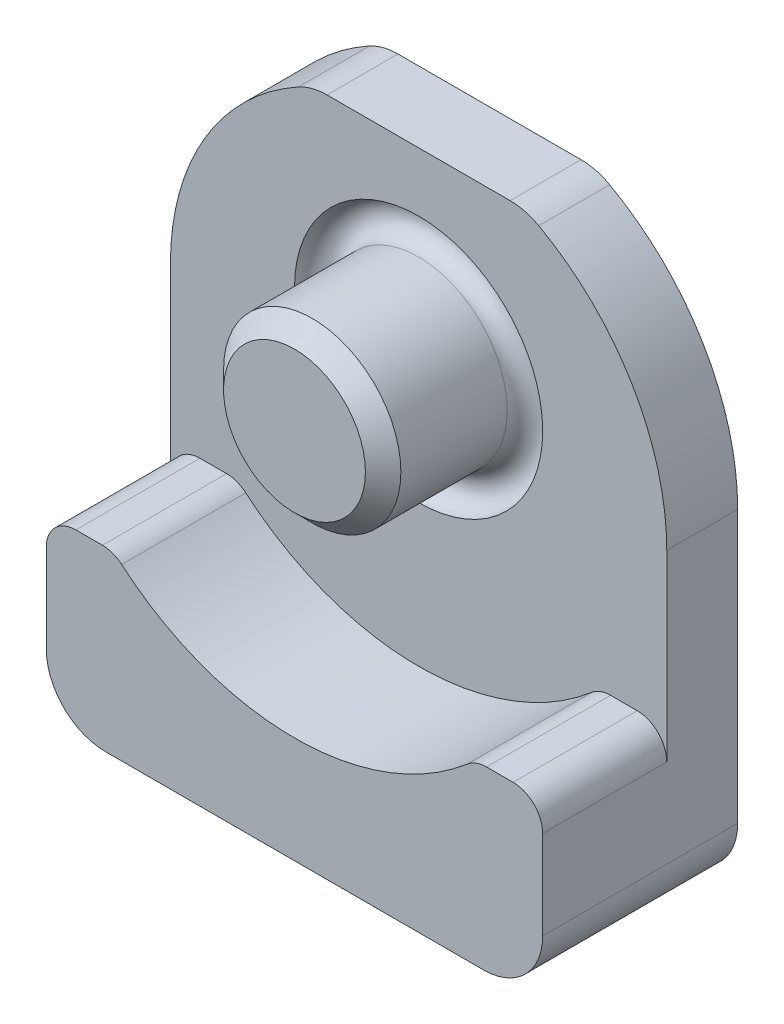
ISO-10303-21;
HEADER;
FILE_DESCRIPTION(('STEP AP214'),'2;1');
FILE_NAME('part.step','',(''),(''),'','','');
FILE_SCHEMA(('AUTOMOTIVE_DESIGN { 1 0 10303 214 1 1 1 1 }'));
ENDSEC;
DATA;
#1=APPLICATION_CONTEXT('core data for automotive mechanical design processes');
#2=APPLICATION_PROTOCOL_DEFINITION('international standard','automotive_design',2000,#1);
#3=PRODUCT_CONTEXT('',#1,'mechanical');
#4=PRODUCT('Part','Part','',(#3));
#5=PRODUCT_RELATED_PRODUCT_CATEGORY('part','',(#4));
#6=PRODUCT_DEFINITION_FORMATION('','',#4);
#7=PRODUCT_DEFINITION_CONTEXT('part definition',#1,'design');
#8=PRODUCT_DEFINITION('design','',#6,#7);
#9=PRODUCT_DEFINITION_SHAPE('','',#8);
#10=(LENGTH_UNIT() NAMED_UNIT(*) SI_UNIT(.MILLI.,.METRE.));
#11=(NAMED_UNIT(*) PLANE_ANGLE_UNIT() SI_UNIT($,.RADIAN.));
#12=(NAMED_UNIT(*) SI_UNIT($,.STERADIAN.) SOLID_ANGLE_UNIT());
#13=UNCERTAINTY_MEASURE_WITH_UNIT(LENGTH_MEASURE(1.E-05),#10,'distance_accuracy_value','');
#14=(GEOMETRIC_REPRESENTATION_CONTEXT(3) GLOBAL_UNCERTAINTY_ASSIGNED_CONTEXT((#13)) GLOBAL_UNIT_ASSIGNED_CONTEXT((#10,
#11,#12)) REPRESENTATION_CONTEXT('',''));
#15=CARTESIAN_POINT('',(0.,0.,0.));
#16=DIRECTION('',(0.,0.,1.));
#17=DIRECTION('',(1.,0.,0.));
#18=AXIS2_PLACEMENT_3D('',#15,#16,#17);
#19=CARTESIAN_POINT('',(0.,-0.399999999999999,1.2));
#20=DIRECTION('',(0.,0.,1.));
#21=DIRECTION('',(1.,0.,0.));
#22=AXIS2_PLACEMENT_3D('',#19,#20,#21);
#23=PLANE('',#22);
#24=DIRECTION('',(1.,0.,0.));
#25=VECTOR('',#24,1.);
#26=CARTESIAN_POINT('',(-1.78885438199984,3.4,1.2));
#27=LINE('',#26,#25);
#28=CARTESIAN_POINT('',(-1.54919333848297,3.4,1.2));
#29=VERTEX_POINT('',#28);
#30=CARTESIAN_POINT('',(1.54919333848297,3.4,1.2));
#31=VERTEX_POINT('',#30);
#32=EDGE_CURVE('E373',#29,#31,#27,.T.);
#33=ORIENTED_EDGE('',*,*,#32,.F.);
#34=CARTESIAN_POINT('',(-1.54919333848297,2.4,1.2));
#35=DIRECTION('',(0.,0.,1.));
#36=DIRECTION('',(1.,0.,0.));
#37=AXIS2_PLACEMENT_3D('',#34,#35,#36);
#38=CIRCLE('',#37,1.);
#39=CARTESIAN_POINT('',(-2.0333162567589,3.275,1.2));
#40=VERTEX_POINT('',#39);
#41=EDGE_CURVE('E168',#29,#40,#38,.T.);
#42=ORIENTED_EDGE('',*,*,#41,.T.);
#43=CARTESIAN_POINT('',(0.,-0.399999999999999,1.2));
#44=DIRECTION('',(0.,0.,1.));
#45=DIRECTION('',(1.,0.,0.));
#46=AXIS2_PLACEMENT_3D('',#43,#44,#45);
#47=CIRCLE('',#46,4.2);
#48=CARTESIAN_POINT('',(-4.2,-0.399999999999999,1.2));
#49=VERTEX_POINT('',#48);
#50=EDGE_CURVE('E165',#49,#40,#47,.F.);
#51=ORIENTED_EDGE('',*,*,#50,.F.);
#52=DIRECTION('',(0.,1.,0.));
#53=VECTOR('',#52,1.);
#54=CARTESIAN_POINT('',(-4.2,-0.399999999999999,1.2));
#55=LINE('',#54,#53);
#56=CARTESIAN_POINT('',(-4.2,-3.5,1.2));
#57=VERTEX_POINT('',#56);
#58=EDGE_CURVE('E57',#57,#49,#55,.T.);
#59=ORIENTED_EDGE('',*,*,#58,.F.);
#60=CARTESIAN_POINT('',(-3.7,-3.5,1.2));
#61=DIRECTION('',(0.,0.,1.));
#62=DIRECTION('',(1.,0.,0.));
#63=AXIS2_PLACEMENT_3D('',#60,#61,#62);
#64=CIRCLE('',#63,0.5);
#65=CARTESIAN_POINT('',(-3.7,-3.,1.2));
#66=VERTEX_POINT('',#65);
#67=EDGE_CURVE('E62',#57,#66,#64,.F.);
#68=ORIENTED_EDGE('',*,*,#67,.T.);
#69=DIRECTION('',(-1.,0.,0.));
#70=VECTOR('',#69,1.);
#71=CARTESIAN_POINT('',(-4.2,-3.,1.2));
#72=LINE('',#71,#70);
#73=CARTESIAN_POINT('',(-3.24961536185438,-3.,1.2));
#74=VERTEX_POINT('',#73);
#75=EDGE_CURVE('E184',#74,#66,#72,.T.);
#76=ORIENTED_EDGE('',*,*,#75,.F.);
#77=CARTESIAN_POINT('',(-3.24961536185438,-3.5,1.2));
#78=DIRECTION('',(0.,0.,1.));
#79=DIRECTION('',(1.,0.,0.));
#80=AXIS2_PLACEMENT_3D('',#77,#78,#79);
#81=CIRCLE('',#80,0.5);
#82=CARTESIAN_POINT('',(-2.92465382566894,-3.12,1.2));
#83=VERTEX_POINT('',#82);
#84=EDGE_CURVE('E270',#74,#83,#81,.F.);
#85=ORIENTED_EDGE('',*,*,#84,.T.);
#86=CARTESIAN_POINT('',(0.,0.3,1.2));
#87=DIRECTION('',(0.,0.,1.));
#88=DIRECTION('',(1.,0.,0.));
#89=AXIS2_PLACEMENT_3D('',#86,#87,#88);
#90=CIRCLE('',#89,4.5);
#91=CARTESIAN_POINT('',(2.92465382566895,-3.12,1.2));
#92=VERTEX_POINT('',#91);
#93=EDGE_CURVE('E417',#92,#83,#90,.F.);
#94=ORIENTED_EDGE('',*,*,#93,.F.);
#95=CARTESIAN_POINT('',(3.24961536185438,-3.5,1.2));
#96=DIRECTION('',(0.,0.,1.));
#97=DIRECTION('',(1.,0.,0.));
#98=AXIS2_PLACEMENT_3D('',#95,#96,#97);
#99=CIRCLE('',#98,0.5);
#100=CARTESIAN_POINT('',(3.24961536185438,-3.,1.2));
#101=VERTEX_POINT('',#100);
#102=EDGE_CURVE('E267',#92,#101,#99,.F.);
#103=ORIENTED_EDGE('',*,*,#102,.T.);
#104=DIRECTION('',(-1.,0.,0.));
#105=VECTOR('',#104,1.);
#106=CARTESIAN_POINT('',(3.05941170815567,-3.,1.2));
#107=LINE('',#106,#105);
#108=CARTESIAN_POINT('',(3.7,-3.,1.2));
#109=VERTEX_POINT('',#108);
#110=EDGE_CURVE('E411',#109,#101,#107,.T.);
#111=ORIENTED_EDGE('',*,*,#110,.F.);
#112=CARTESIAN_POINT('',(3.7,-3.5,1.2));
#113=DIRECTION('',(0.,0.,1.));
#114=DIRECTION('',(1.,0.,0.));
#115=AXIS2_PLACEMENT_3D('',#112,#113,#114);
#116=CIRCLE('',#115,0.5);
#117=CARTESIAN_POINT('',(4.2,-3.5,1.2));
#118=VERTEX_POINT('',#117);
#119=EDGE_CURVE('E264',#109,#118,#116,.F.);
#120=ORIENTED_EDGE('',*,*,#119,.T.);
#121=DIRECTION('',(0.,-1.,0.));
#122=VECTOR('',#121,1.);
#123=CARTESIAN_POINT('',(4.2,-3.,1.2));
#124=LINE('',#123,#122);
#125=CARTESIAN_POINT('',(4.2,-0.399999999999999,1.2));
#126=VERTEX_POINT('',#125);
#127=EDGE_CURVE('E376',#126,#118,#124,.T.);
#128=ORIENTED_EDGE('',*,*,#127,.F.);
#129=CARTESIAN_POINT('',(2.0333162567589,3.275,1.2));
#130=VERTEX_POINT('',#129);
#131=EDGE_CURVE('E173',#130,#126,#47,.F.);
#132=ORIENTED_EDGE('',*,*,#131,.F.);
#133=CARTESIAN_POINT('',(1.54919333848297,2.4,1.2));
#134=DIRECTION('',(0.,0.,1.));
#135=DIRECTION('',(1.,0.,0.));
#136=AXIS2_PLACEMENT_3D('',#133,#134,#135);
#137=CIRCLE('',#136,1.);
#138=EDGE_CURVE('E229',#130,#31,#137,.T.);
#139=ORIENTED_EDGE('',*,*,#138,.T.);
#140=EDGE_LOOP('',(#33,#42,#51,#59,#68,#76,#85,#94,#103,#111,#120,#128,#132,#139));
#141=FACE_BOUND('',#140,.T.);
#142=CARTESIAN_POINT('',(0.,0.3,1.2));
#143=DIRECTION('',(0.,0.,1.));
#144=DIRECTION('',(0.,-1.,0.));
#145=AXIS2_PLACEMENT_3D('',#142,#143,#144);
#146=CIRCLE('',#145,2.1);
#147=CARTESIAN_POINT('',(0.,-1.8,1.2));
#148=VERTEX_POINT('',#147);
#149=EDGE_CURVE('E424',#148,#148,#146,.T.);
#150=ORIENTED_EDGE('',*,*,#149,.F.);
#151=EDGE_LOOP('',(#150));
#152=FACE_BOUND('',#151,.T.);
#153=ADVANCED_FACE('F41',(#141,#152),#23,.T.);
#154=CARTESIAN_POINT('',(0.,-0.399999999999999,3.3));
#155=DIRECTION('',(0.,0.,-1.));
#156=DIRECTION('',(-1.,0.,0.));
#157=AXIS2_PLACEMENT_3D('',#154,#155,#156);
#158=CYLINDRICAL_SURFACE('',#157,4.2);
#159=ORIENTED_EDGE('',*,*,#50,.T.);
#160=DIRECTION('',(0.,0.,-1.));
#161=VECTOR('',#160,1.);
#162=CARTESIAN_POINT('',(-2.0333162567589,3.275,3.3));
#163=LINE('',#162,#161);
#164=CARTESIAN_POINT('',(-2.0333162567589,3.275,0.));
#165=VERTEX_POINT('',#164);
#166=EDGE_CURVE('E232',#40,#165,#163,.T.);
#167=ORIENTED_EDGE('',*,*,#166,.T.);
#168=CARTESIAN_POINT('',(0.,-0.399999999999999,0.));
#169=DIRECTION('',(0.,0.,1.));
#170=DIRECTION('',(1.,0.,0.));
#171=AXIS2_PLACEMENT_3D('',#168,#169,#170);
#172=CIRCLE('',#171,4.2);
#173=CARTESIAN_POINT('',(-4.2,-0.399999999999999,0.));
#174=VERTEX_POINT('',#173);
#175=EDGE_CURVE('E189',#165,#174,#172,.T.);
#176=ORIENTED_EDGE('',*,*,#175,.T.);
#177=DIRECTION('',(0.,0.,-1.));
#178=VECTOR('',#177,1.);
#179=CARTESIAN_POINT('',(-4.2,-0.399999999999999,3.3));
#180=LINE('',#179,#178);
#181=EDGE_CURVE('E180',#49,#174,#180,.T.);
#182=ORIENTED_EDGE('',*,*,#181,.F.);
#183=EDGE_LOOP('',(#159,#167,#176,#182));
#184=FACE_BOUND('',#183,.T.);
#185=ADVANCED_FACE('F187',(#184),#158,.T.);
#186=CARTESIAN_POINT('',(4.2,-0.399999999999998,0.));
#187=VERTEX_POINT('',#186);
#188=CARTESIAN_POINT('',(2.0333162567589,3.275,0.));
#189=VERTEX_POINT('',#188);
#190=EDGE_CURVE('E388',#187,#189,#172,.T.);
#191=ORIENTED_EDGE('',*,*,#190,.T.);
#192=DIRECTION('',(0.,0.,-1.));
#193=VECTOR('',#192,1.);
#194=CARTESIAN_POINT('',(2.0333162567589,3.275,3.3));
#195=LINE('',#194,#193);
#196=EDGE_CURVE('E234',#189,#130,#195,.F.);
#197=ORIENTED_EDGE('',*,*,#196,.T.);
#198=ORIENTED_EDGE('',*,*,#131,.T.);
#199=DIRECTION('',(0.,0.,-1.));
#200=VECTOR('',#199,1.);
#201=CARTESIAN_POINT('',(4.2,-0.399999999999998,3.3));
#202=LINE('',#201,#200);
#203=EDGE_CURVE('E190',#126,#187,#202,.T.);
#204=ORIENTED_EDGE('',*,*,#203,.T.);
#205=EDGE_LOOP('',(#191,#197,#198,#204));
#206=FACE_BOUND('',#205,.T.);
#207=ADVANCED_FACE('F290',(#206),#158,.T.);
#208=CARTESIAN_POINT('',(4.2,-6.,3.3));
#209=DIRECTION('',(0.,1.,0.));
#210=DIRECTION('',(-1.,0.,0.));
#211=AXIS2_PLACEMENT_3D('',#208,#209,#210);
#212=PLANE('',#211);
#213=DIRECTION('',(1.,0.,0.));
#214=VECTOR('',#213,1.);
#215=CARTESIAN_POINT('',(4.2,-6.,3.3));
#216=LINE('',#215,#214);
#217=CARTESIAN_POINT('',(-3.2,-6.,3.3));
#218=VERTEX_POINT('',#217);
#219=CARTESIAN_POINT('',(3.2,-6.,3.3));
#220=VERTEX_POINT('',#219);
#221=EDGE_CURVE('E381',#218,#220,#216,.T.);
#222=ORIENTED_EDGE('',*,*,#221,.F.);
#223=DIRECTION('',(0.,0.,-1.));
#224=VECTOR('',#223,1.);
#225=CARTESIAN_POINT('',(-3.2,-6.,3.3));
#226=LINE('',#225,#224);
#227=CARTESIAN_POINT('',(-3.2,-6.,0.));
#228=VERTEX_POINT('',#227);
#229=EDGE_CURVE('E203',#218,#228,#226,.T.);
#230=ORIENTED_EDGE('',*,*,#229,.T.);
#231=DIRECTION('',(1.,0.,0.));
#232=VECTOR('',#231,1.);
#233=CARTESIAN_POINT('',(4.2,-6.,0.));
#234=LINE('',#233,#232);
#235=CARTESIAN_POINT('',(3.2,-6.,0.));
#236=VERTEX_POINT('',#235);
#237=EDGE_CURVE('E172',#228,#236,#234,.T.);
#238=ORIENTED_EDGE('',*,*,#237,.T.);
#239=DIRECTION('',(0.,0.,-1.));
#240=VECTOR('',#239,1.);
#241=CARTESIAN_POINT('',(3.2,-6.,3.3));
#242=LINE('',#241,#240);
#243=EDGE_CURVE('E194',#236,#220,#242,.F.);
#244=ORIENTED_EDGE('',*,*,#243,.T.);
#245=EDGE_LOOP('',(#222,#230,#238,#244));
#246=FACE_BOUND('',#245,.T.);
#247=ADVANCED_FACE('F325',(#246),#212,.F.);
#248=CARTESIAN_POINT('',(4.2,-0.399999999999998,3.3));
#249=DIRECTION('',(-1.,0.,0.));
#250=DIRECTION('',(0.,-1.,0.));
#251=AXIS2_PLACEMENT_3D('',#248,#249,#250);
#252=PLANE('',#251);
#253=ORIENTED_EDGE('',*,*,#127,.T.);
#254=DIRECTION('',(0.,0.,1.));
#255=VECTOR('',#254,1.);
#256=CARTESIAN_POINT('',(4.2,-3.5,3.3));
#257=LINE('',#256,#255);
#258=CARTESIAN_POINT('',(4.2,-3.5,3.3));
#259=VERTEX_POINT('',#258);
#260=EDGE_CURVE('E237',#118,#259,#257,.T.);
#261=ORIENTED_EDGE('',*,*,#260,.T.);
#262=DIRECTION('',(0.,1.,0.));
#263=VECTOR('',#262,1.);
#264=CARTESIAN_POINT('',(4.2,-0.399999999999998,3.3));
#265=LINE('',#264,#263);
#266=CARTESIAN_POINT('',(4.2,-5.,3.3));
#267=VERTEX_POINT('',#266);
#268=EDGE_CURVE('E196',#267,#259,#265,.T.);
#269=ORIENTED_EDGE('',*,*,#268,.F.);
#270=DIRECTION('',(0.,0.,-1.));
#271=VECTOR('',#270,1.);
#272=CARTESIAN_POINT('',(4.2,-5.,3.3));
#273=LINE('',#272,#271);
#274=CARTESIAN_POINT('',(4.2,-5.,0.));
#275=VERTEX_POINT('',#274);
#276=EDGE_CURVE('E221',#267,#275,#273,.T.);
#277=ORIENTED_EDGE('',*,*,#276,.T.);
#278=DIRECTION('',(0.,1.,0.));
#279=VECTOR('',#278,1.);
#280=CARTESIAN_POINT('',(4.2,-0.399999999999998,0.));
#281=LINE('',#280,#279);
#282=EDGE_CURVE('E387',#275,#187,#281,.T.);
#283=ORIENTED_EDGE('',*,*,#282,.T.);
#284=ORIENTED_EDGE('',*,*,#203,.F.);
#285=EDGE_LOOP('',(#253,#261,#269,#277,#283,#284));
#286=FACE_BOUND('',#285,.T.);
#287=ADVANCED_FACE('F322',(#286),#252,.F.);
#288=CARTESIAN_POINT('',(-4.2,-6.,3.3));
#289=DIRECTION('',(1.,0.,0.));
#290=DIRECTION('',(0.,0.,-1.));
#291=AXIS2_PLACEMENT_3D('',#288,#289,#290);
#292=PLANE('',#291);
#293=DIRECTION('',(0.,-1.,0.));
#294=VECTOR('',#293,1.);
#295=CARTESIAN_POINT('',(-4.2,-6.,3.3));
#296=LINE('',#295,#294);
#297=CARTESIAN_POINT('',(-4.2,-3.5,3.3));
#298=VERTEX_POINT('',#297);
#299=CARTESIAN_POINT('',(-4.2,-5.,3.3));
#300=VERTEX_POINT('',#299);
#301=EDGE_CURVE('E191',#298,#300,#296,.T.);
#302=ORIENTED_EDGE('',*,*,#301,.F.);
#303=DIRECTION('',(0.,0.,1.));
#304=VECTOR('',#303,1.);
#305=CARTESIAN_POINT('',(-4.2,-3.5,3.3));
#306=LINE('',#305,#304);
#307=EDGE_CURVE('E183',#298,#57,#306,.F.);
#308=ORIENTED_EDGE('',*,*,#307,.T.);
#309=ORIENTED_EDGE('',*,*,#58,.T.);
#310=ORIENTED_EDGE('',*,*,#181,.T.);
#311=DIRECTION('',(0.,-1.,0.));
#312=VECTOR('',#311,1.);
#313=CARTESIAN_POINT('',(-4.2,-6.,0.));
#314=LINE('',#313,#312);
#315=CARTESIAN_POINT('',(-4.2,-5.,0.));
#316=VERTEX_POINT('',#315);
#317=EDGE_CURVE('E199',#174,#316,#314,.T.);
#318=ORIENTED_EDGE('',*,*,#317,.T.);
#319=DIRECTION('',(0.,0.,-1.));
#320=VECTOR('',#319,1.);
#321=CARTESIAN_POINT('',(-4.2,-5.,3.3));
#322=LINE('',#321,#320);
#323=EDGE_CURVE('E214',#316,#300,#322,.F.);
#324=ORIENTED_EDGE('',*,*,#323,.T.);
#325=EDGE_LOOP('',(#302,#308,#309,#310,#318,#324));
#326=FACE_BOUND('',#325,.T.);
#327=ADVANCED_FACE('F178',(#326),#292,.F.);
#328=CARTESIAN_POINT('',(0.,-0.399999999999999,3.3));
#329=DIRECTION('',(0.,0.,1.));
#330=DIRECTION('',(1.,0.,0.));
#331=AXIS2_PLACEMENT_3D('',#328,#329,#330);
#332=PLANE('',#331);
#333=ORIENTED_EDGE('',*,*,#268,.T.);
#334=CARTESIAN_POINT('',(3.7,-3.5,3.3));
#335=DIRECTION('',(0.,0.,1.));
#336=DIRECTION('',(1.,0.,0.));
#337=AXIS2_PLACEMENT_3D('',#334,#335,#336);
#338=CIRCLE('',#337,0.5);
#339=CARTESIAN_POINT('',(3.7,-3.,3.3));
#340=VERTEX_POINT('',#339);
#341=EDGE_CURVE('E246',#259,#340,#338,.T.);
#342=ORIENTED_EDGE('',*,*,#341,.T.);
#343=DIRECTION('',(1.,0.,0.));
#344=VECTOR('',#343,1.);
#345=CARTESIAN_POINT('',(3.05941170815567,-3.,3.3));
#346=LINE('',#345,#344);
#347=CARTESIAN_POINT('',(3.24961536185438,-3.,3.3));
#348=VERTEX_POINT('',#347);
#349=EDGE_CURVE('E185',#348,#340,#346,.T.);
#350=ORIENTED_EDGE('',*,*,#349,.F.);
#351=CARTESIAN_POINT('',(3.24961536185438,-3.5,3.3));
#352=DIRECTION('',(0.,0.,1.));
#353=DIRECTION('',(1.,0.,0.));
#354=AXIS2_PLACEMENT_3D('',#351,#352,#353);
#355=CIRCLE('',#354,0.5);
#356=CARTESIAN_POINT('',(2.92465382566895,-3.12,3.3));
#357=VERTEX_POINT('',#356);
#358=EDGE_CURVE('E244',#348,#357,#355,.T.);
#359=ORIENTED_EDGE('',*,*,#358,.T.);
#360=CARTESIAN_POINT('',(0.,0.3,3.3));
#361=DIRECTION('',(0.,0.,1.));
#362=DIRECTION('',(1.,0.,0.));
#363=AXIS2_PLACEMENT_3D('',#360,#361,#362);
#364=CIRCLE('',#363,4.5);
#365=CARTESIAN_POINT('',(-2.92465382566894,-3.12,3.3));
#366=VERTEX_POINT('',#365);
#367=EDGE_CURVE('E367',#366,#357,#364,.T.);
#368=ORIENTED_EDGE('',*,*,#367,.F.);
#369=CARTESIAN_POINT('',(-3.24961536185438,-3.5,3.3));
#370=DIRECTION('',(0.,0.,1.));
#371=DIRECTION('',(1.,0.,0.));
#372=AXIS2_PLACEMENT_3D('',#369,#370,#371);
#373=CIRCLE('',#372,0.5);
#374=CARTESIAN_POINT('',(-3.24961536185438,-3.,3.3));
#375=VERTEX_POINT('',#374);
#376=EDGE_CURVE('E240',#366,#375,#373,.T.);
#377=ORIENTED_EDGE('',*,*,#376,.T.);
#378=DIRECTION('',(1.,0.,0.));
#379=VECTOR('',#378,1.);
#380=CARTESIAN_POINT('',(-4.2,-3.,3.3));
#381=LINE('',#380,#379);
#382=CARTESIAN_POINT('',(-3.7,-3.,3.3));
#383=VERTEX_POINT('',#382);
#384=EDGE_CURVE('E363',#383,#375,#381,.T.);
#385=ORIENTED_EDGE('',*,*,#384,.F.);
#386=CARTESIAN_POINT('',(-3.7,-3.5,3.3));
#387=DIRECTION('',(0.,0.,1.));
#388=DIRECTION('',(1.,0.,0.));
#389=AXIS2_PLACEMENT_3D('',#386,#387,#388);
#390=CIRCLE('',#389,0.5);
#391=EDGE_CURVE('E242',#383,#298,#390,.T.);
#392=ORIENTED_EDGE('',*,*,#391,.T.);
#393=ORIENTED_EDGE('',*,*,#301,.T.);
#394=CARTESIAN_POINT('',(-3.2,-5.,3.3));
#395=DIRECTION('',(0.,0.,1.));
#396=DIRECTION('',(1.,0.,0.));
#397=AXIS2_PLACEMENT_3D('',#394,#395,#396);
#398=CIRCLE('',#397,1.);
#399=EDGE_CURVE('E219',#300,#218,#398,.T.);
#400=ORIENTED_EDGE('',*,*,#399,.T.);
#401=ORIENTED_EDGE('',*,*,#221,.T.);
#402=CARTESIAN_POINT('',(3.2,-5.,3.3));
#403=DIRECTION('',(0.,0.,1.));
#404=DIRECTION('',(1.,0.,0.));
#405=AXIS2_PLACEMENT_3D('',#402,#403,#404);
#406=CIRCLE('',#405,1.);
#407=EDGE_CURVE('E217',#220,#267,#406,.T.);
#408=ORIENTED_EDGE('',*,*,#407,.T.);
#409=EDGE_LOOP('',(#333,#342,#350,#359,#368,#377,#385,#392,#393,#400,#401,#408));
#410=FACE_BOUND('',#409,.T.);
#411=ADVANCED_FACE('F314',(#410),#332,.T.);
#412=CARTESIAN_POINT('',(0.,-0.399999999999999,0.));
#413=DIRECTION('',(0.,0.,1.));
#414=DIRECTION('',(1.,0.,0.));
#415=AXIS2_PLACEMENT_3D('',#412,#413,#414);
#416=PLANE('',#415);
#417=ORIENTED_EDGE('',*,*,#237,.F.);
#418=CARTESIAN_POINT('',(-3.2,-5.,0.));
#419=DIRECTION('',(0.,0.,1.));
#420=DIRECTION('',(1.,0.,0.));
#421=AXIS2_PLACEMENT_3D('',#418,#419,#420);
#422=CIRCLE('',#421,1.);
#423=EDGE_CURVE('E212',#228,#316,#422,.F.);
#424=ORIENTED_EDGE('',*,*,#423,.T.);
#425=ORIENTED_EDGE('',*,*,#317,.F.);
#426=ORIENTED_EDGE('',*,*,#175,.F.);
#427=CARTESIAN_POINT('',(-1.54919333848297,2.4,0.));
#428=DIRECTION('',(0.,0.,1.));
#429=DIRECTION('',(1.,0.,0.));
#430=AXIS2_PLACEMENT_3D('',#427,#428,#429);
#431=CIRCLE('',#430,1.);
#432=CARTESIAN_POINT('',(-1.54919333848297,3.4,0.));
#433=VERTEX_POINT('',#432);
#434=EDGE_CURVE('E208',#165,#433,#431,.F.);
#435=ORIENTED_EDGE('',*,*,#434,.T.);
#436=DIRECTION('',(1.,0.,0.));
#437=VECTOR('',#436,1.);
#438=CARTESIAN_POINT('',(-1.78885438199984,3.4,0.));
#439=LINE('',#438,#437);
#440=CARTESIAN_POINT('',(1.54919333848297,3.4,0.));
#441=VERTEX_POINT('',#440);
#442=EDGE_CURVE('E368',#433,#441,#439,.T.);
#443=ORIENTED_EDGE('',*,*,#442,.T.);
#444=CARTESIAN_POINT('',(1.54919333848297,2.4,0.));
#445=DIRECTION('',(0.,0.,1.));
#446=DIRECTION('',(1.,0.,0.));
#447=AXIS2_PLACEMENT_3D('',#444,#445,#446);
#448=CIRCLE('',#447,1.);
#449=EDGE_CURVE('E206',#441,#189,#448,.F.);
#450=ORIENTED_EDGE('',*,*,#449,.T.);
#451=ORIENTED_EDGE('',*,*,#190,.F.);
#452=ORIENTED_EDGE('',*,*,#282,.F.);
#453=CARTESIAN_POINT('',(3.2,-5.,0.));
#454=DIRECTION('',(0.,0.,1.));
#455=DIRECTION('',(1.,0.,0.));
#456=AXIS2_PLACEMENT_3D('',#453,#454,#455);
#457=CIRCLE('',#456,1.);
#458=EDGE_CURVE('E210',#275,#236,#457,.F.);
#459=ORIENTED_EDGE('',*,*,#458,.T.);
#460=EDGE_LOOP('',(#417,#424,#425,#426,#435,#443,#450,#451,#452,#459));
#461=FACE_BOUND('',#460,.T.);
#462=ADVANCED_FACE('F312',(#461),#416,.F.);
#463=CARTESIAN_POINT('',(-4.2,-3.,-11.6));
#464=DIRECTION('',(0.,-1.,0.));
#465=DIRECTION('',(0.,0.,-1.));
#466=AXIS2_PLACEMENT_3D('',#463,#464,#465);
#467=PLANE('',#466);
#468=ORIENTED_EDGE('',*,*,#75,.T.);
#469=DIRECTION('',(0.,0.,1.));
#470=VECTOR('',#469,1.);
#471=CARTESIAN_POINT('',(-3.7,-3.,-11.6));
#472=LINE('',#471,#470);
#473=EDGE_CURVE('E260',#66,#383,#472,.T.);
#474=ORIENTED_EDGE('',*,*,#473,.T.);
#475=ORIENTED_EDGE('',*,*,#384,.T.);
#476=DIRECTION('',(0.,0.,1.));
#477=VECTOR('',#476,1.);
#478=CARTESIAN_POINT('',(-3.24961536185438,-3.,-11.6));
#479=LINE('',#478,#477);
#480=EDGE_CURVE('E258',#375,#74,#479,.F.);
#481=ORIENTED_EDGE('',*,*,#480,.T.);
#482=EDGE_LOOP('',(#468,#474,#475,#481));
#483=FACE_BOUND('',#482,.T.);
#484=ADVANCED_FACE('F308',(#483),#467,.F.);
#485=CARTESIAN_POINT('',(0.,0.3,-11.6));
#486=DIRECTION('',(0.,0.,1.));
#487=DIRECTION('',(1.,0.,0.));
#488=AXIS2_PLACEMENT_3D('',#485,#486,#487);
#489=CYLINDRICAL_SURFACE('',#488,4.5);
#490=ORIENTED_EDGE('',*,*,#367,.T.);
#491=DIRECTION('',(0.,0.,1.));
#492=VECTOR('',#491,1.);
#493=CARTESIAN_POINT('',(2.92465382566895,-3.12,-11.6));
#494=LINE('',#493,#492);
#495=EDGE_CURVE('E256',#357,#92,#494,.F.);
#496=ORIENTED_EDGE('',*,*,#495,.T.);
#497=ORIENTED_EDGE('',*,*,#93,.T.);
#498=DIRECTION('',(0.,0.,1.));
#499=VECTOR('',#498,1.);
#500=CARTESIAN_POINT('',(-2.92465382566894,-3.12,-11.6));
#501=LINE('',#500,#499);
#502=EDGE_CURVE('E253',#83,#366,#501,.T.);
#503=ORIENTED_EDGE('',*,*,#502,.T.);
#504=EDGE_LOOP('',(#490,#496,#497,#503));
#505=FACE_BOUND('',#504,.T.);
#506=ADVANCED_FACE('F304',(#505),#489,.F.);
#507=CARTESIAN_POINT('',(3.05941170815567,-3.,-11.6));
#508=DIRECTION('',(0.,-1.,0.));
#509=DIRECTION('',(0.,0.,-1.));
#510=AXIS2_PLACEMENT_3D('',#507,#508,#509);
#511=PLANE('',#510);
#512=ORIENTED_EDGE('',*,*,#349,.T.);
#513=DIRECTION('',(0.,0.,1.));
#514=VECTOR('',#513,1.);
#515=CARTESIAN_POINT('',(3.7,-3.,-11.6));
#516=LINE('',#515,#514);
#517=EDGE_CURVE('E251',#340,#109,#516,.F.);
#518=ORIENTED_EDGE('',*,*,#517,.T.);
#519=ORIENTED_EDGE('',*,*,#110,.T.);
#520=DIRECTION('',(0.,0.,1.));
#521=VECTOR('',#520,1.);
#522=CARTESIAN_POINT('',(3.24961536185438,-3.,-11.6));
#523=LINE('',#522,#521);
#524=EDGE_CURVE('E248',#101,#348,#523,.T.);
#525=ORIENTED_EDGE('',*,*,#524,.T.);
#526=EDGE_LOOP('',(#512,#518,#519,#525));
#527=FACE_BOUND('',#526,.T.);
#528=ADVANCED_FACE('F301',(#527),#511,.F.);
#529=CARTESIAN_POINT('',(-1.78885438199984,3.4,0.));
#530=DIRECTION('',(0.,-1.,0.));
#531=DIRECTION('',(0.,0.,-1.));
#532=AXIS2_PLACEMENT_3D('',#529,#530,#531);
#533=PLANE('',#532);
#534=ORIENTED_EDGE('',*,*,#442,.F.);
#535=DIRECTION('',(0.,0.,-1.));
#536=VECTOR('',#535,1.);
#537=CARTESIAN_POINT('',(-1.54919333848297,3.4,0.));
#538=LINE('',#537,#536);
#539=EDGE_CURVE('E226',#433,#29,#538,.F.);
#540=ORIENTED_EDGE('',*,*,#539,.T.);
#541=ORIENTED_EDGE('',*,*,#32,.T.);
#542=DIRECTION('',(0.,0.,-1.));
#543=VECTOR('',#542,1.);
#544=CARTESIAN_POINT('',(1.54919333848297,3.4,0.));
#545=LINE('',#544,#543);
#546=EDGE_CURVE('E224',#31,#441,#545,.T.);
#547=ORIENTED_EDGE('',*,*,#546,.T.);
#548=EDGE_LOOP('',(#534,#540,#541,#547));
#549=FACE_BOUND('',#548,.T.);
#550=ADVANCED_FACE('F294',(#549),#533,.F.);
#551=CARTESIAN_POINT('',(0.,0.3,1.2));
#552=DIRECTION('',(0.,0.,1.));
#553=DIRECTION('',(0.,-1.,0.));
#554=AXIS2_PLACEMENT_3D('',#551,#552,#553);
#555=TOROIDAL_SURFACE('',#554,1.8,0.3);
#556=ORIENTED_EDGE('',*,*,#149,.T.);
#557=EDGE_LOOP('',(#556));
#558=FACE_BOUND('',#557,.T.);
#559=CARTESIAN_POINT('',(0.,0.3,1.2));
#560=DIRECTION('',(0.,0.,1.));
#561=DIRECTION('',(0.,-1.,0.));
#562=AXIS2_PLACEMENT_3D('',#559,#560,#561);
#563=CIRCLE('',#562,1.5);
#564=CARTESIAN_POINT('',(0.,-1.2,1.2));
#565=VERTEX_POINT('',#564);
#566=EDGE_CURVE('E428',#565,#565,#563,.T.);
#567=ORIENTED_EDGE('',*,*,#566,.F.);
#568=EDGE_LOOP('',(#567));
#569=FACE_BOUND('',#568,.T.);
#570=ADVANCED_FACE('F433',(#558,#569),#555,.F.);
#571=CARTESIAN_POINT('',(0.,0.3,3.3));
#572=DIRECTION('',(0.,0.,1.));
#573=DIRECTION('',(1.,0.,0.));
#574=AXIS2_PLACEMENT_3D('',#571,#572,#573);
#575=CIRCLE('',#574,1.2);
#576=CARTESIAN_POINT('',(1.2,0.3,3.3));
#577=VERTEX_POINT('',#576);
#578=EDGE_CURVE('E50',#577,#577,#575,.T.);
#579=ORIENTED_EDGE('',*,*,#578,.T.);
#580=EDGE_LOOP('',(#579));
#581=FACE_BOUND('',#580,.T.);
#582=ADVANCED_FACE('F274',(#581),#332,.T.);
#583=CARTESIAN_POINT('',(0.,0.3,-11.6));
#584=DIRECTION('',(0.,0.,1.));
#585=DIRECTION('',(1.,0.,0.));
#586=AXIS2_PLACEMENT_3D('',#583,#584,#585);
#587=CYLINDRICAL_SURFACE('',#586,1.5);
#588=CARTESIAN_POINT('',(0.,0.3,3.));
#589=DIRECTION('',(0.,0.,1.));
#590=DIRECTION('',(1.,0.,0.));
#591=AXIS2_PLACEMENT_3D('',#588,#589,#590);
#592=CIRCLE('',#591,1.5);
#593=CARTESIAN_POINT('',(1.5,0.3,3.));
#594=VERTEX_POINT('',#593);
#595=EDGE_CURVE('E12',#594,#594,#592,.F.);
#596=ORIENTED_EDGE('',*,*,#595,.T.);
#597=EDGE_LOOP('',(#596));
#598=FACE_BOUND('',#597,.T.);
#599=ORIENTED_EDGE('',*,*,#566,.T.);
#600=EDGE_LOOP('',(#599));
#601=FACE_BOUND('',#600,.T.);
#602=ADVANCED_FACE('F296',(#598,#601),#587,.T.);
#603=CARTESIAN_POINT('',(-3.2,-5.,3.3));
#604=DIRECTION('',(0.,0.,-1.));
#605=DIRECTION('',(-1.,0.,0.));
#606=AXIS2_PLACEMENT_3D('',#603,#604,#605);
#607=CYLINDRICAL_SURFACE('',#606,1.);
#608=ORIENTED_EDGE('',*,*,#399,.F.);
#609=ORIENTED_EDGE('',*,*,#323,.F.);
#610=ORIENTED_EDGE('',*,*,#423,.F.);
#611=ORIENTED_EDGE('',*,*,#229,.F.);
#612=EDGE_LOOP('',(#608,#609,#610,#611));
#613=FACE_BOUND('',#612,.T.);
#614=ADVANCED_FACE('F299',(#613),#607,.T.);
#615=CARTESIAN_POINT('',(3.2,-5.,3.3));
#616=DIRECTION('',(0.,0.,-1.));
#617=DIRECTION('',(-1.,0.,0.));
#618=AXIS2_PLACEMENT_3D('',#615,#616,#617);
#619=CYLINDRICAL_SURFACE('',#618,1.);
#620=ORIENTED_EDGE('',*,*,#407,.F.);
#621=ORIENTED_EDGE('',*,*,#243,.F.);
#622=ORIENTED_EDGE('',*,*,#458,.F.);
#623=ORIENTED_EDGE('',*,*,#276,.F.);
#624=EDGE_LOOP('',(#620,#621,#622,#623));
#625=FACE_BOUND('',#624,.T.);
#626=ADVANCED_FACE('F335',(#625),#619,.T.);
#627=CARTESIAN_POINT('',(-1.54919333848297,2.4,3.3));
#628=DIRECTION('',(0.,0.,-1.));
#629=DIRECTION('',(-1.,0.,0.));
#630=AXIS2_PLACEMENT_3D('',#627,#628,#629);
#631=CYLINDRICAL_SURFACE('',#630,1.);
#632=ORIENTED_EDGE('',*,*,#434,.F.);
#633=ORIENTED_EDGE('',*,*,#166,.F.);
#634=ORIENTED_EDGE('',*,*,#41,.F.);
#635=ORIENTED_EDGE('',*,*,#539,.F.);
#636=EDGE_LOOP('',(#632,#633,#634,#635));
#637=FACE_BOUND('',#636,.T.);
#638=ADVANCED_FACE('F339',(#637),#631,.T.);
#639=CARTESIAN_POINT('',(1.54919333848297,2.4,3.3));
#640=DIRECTION('',(0.,0.,-1.));
#641=DIRECTION('',(-1.,0.,0.));
#642=AXIS2_PLACEMENT_3D('',#639,#640,#641);
#643=CYLINDRICAL_SURFACE('',#642,1.);
#644=ORIENTED_EDGE('',*,*,#449,.F.);
#645=ORIENTED_EDGE('',*,*,#546,.F.);
#646=ORIENTED_EDGE('',*,*,#138,.F.);
#647=ORIENTED_EDGE('',*,*,#196,.F.);
#648=EDGE_LOOP('',(#644,#645,#646,#647));
#649=FACE_BOUND('',#648,.T.);
#650=ADVANCED_FACE('F343',(#649),#643,.T.);
#651=CARTESIAN_POINT('',(3.7,-3.5,3.3));
#652=DIRECTION('',(0.,0.,1.));
#653=DIRECTION('',(1.,0.,0.));
#654=AXIS2_PLACEMENT_3D('',#651,#652,#653);
#655=CYLINDRICAL_SURFACE('',#654,0.5);
#656=ORIENTED_EDGE('',*,*,#119,.F.);
#657=ORIENTED_EDGE('',*,*,#517,.F.);
#658=ORIENTED_EDGE('',*,*,#341,.F.);
#659=ORIENTED_EDGE('',*,*,#260,.F.);
#660=EDGE_LOOP('',(#656,#657,#658,#659));
#661=FACE_BOUND('',#660,.T.);
#662=ADVANCED_FACE('F347',(#661),#655,.T.);
#663=CARTESIAN_POINT('',(3.24961536185438,-3.5,-11.6));
#664=DIRECTION('',(0.,0.,1.));
#665=DIRECTION('',(1.,0.,0.));
#666=AXIS2_PLACEMENT_3D('',#663,#664,#665);
#667=CYLINDRICAL_SURFACE('',#666,0.5);
#668=ORIENTED_EDGE('',*,*,#102,.F.);
#669=ORIENTED_EDGE('',*,*,#495,.F.);
#670=ORIENTED_EDGE('',*,*,#358,.F.);
#671=ORIENTED_EDGE('',*,*,#524,.F.);
#672=EDGE_LOOP('',(#668,#669,#670,#671));
#673=FACE_BOUND('',#672,.T.);
#674=ADVANCED_FACE('F351',(#673),#667,.T.);
#675=CARTESIAN_POINT('',(-3.7,-3.5,-11.6));
#676=DIRECTION('',(0.,0.,1.));
#677=DIRECTION('',(1.,0.,0.));
#678=AXIS2_PLACEMENT_3D('',#675,#676,#677);
#679=CYLINDRICAL_SURFACE('',#678,0.5);
#680=ORIENTED_EDGE('',*,*,#67,.F.);
#681=ORIENTED_EDGE('',*,*,#307,.F.);
#682=ORIENTED_EDGE('',*,*,#391,.F.);
#683=ORIENTED_EDGE('',*,*,#473,.F.);
#684=EDGE_LOOP('',(#680,#681,#682,#683));
#685=FACE_BOUND('',#684,.T.);
#686=ADVANCED_FACE('F282',(#685),#679,.T.);
#687=CARTESIAN_POINT('',(-3.24961536185438,-3.5,-11.6));
#688=DIRECTION('',(0.,0.,1.));
#689=DIRECTION('',(1.,0.,0.));
#690=AXIS2_PLACEMENT_3D('',#687,#688,#689);
#691=CYLINDRICAL_SURFACE('',#690,0.5);
#692=ORIENTED_EDGE('',*,*,#84,.F.);
#693=ORIENTED_EDGE('',*,*,#480,.F.);
#694=ORIENTED_EDGE('',*,*,#376,.F.);
#695=ORIENTED_EDGE('',*,*,#502,.F.);
#696=EDGE_LOOP('',(#692,#693,#694,#695));
#697=FACE_BOUND('',#696,.T.);
#698=ADVANCED_FACE('F277',(#697),#691,.T.);
#699=CARTESIAN_POINT('',(0.,0.3,3.3));
#700=DIRECTION('',(0.,0.,-1.));
#701=DIRECTION('',(-1.,0.,0.));
#702=AXIS2_PLACEMENT_3D('',#699,#700,#701);
#703=CONICAL_SURFACE('',#702,1.2,0.785398163397447);
#704=ORIENTED_EDGE('',*,*,#595,.F.);
#705=EDGE_LOOP('',(#704));
#706=FACE_BOUND('',#705,.T.);
#707=ORIENTED_EDGE('',*,*,#578,.F.);
#708=EDGE_LOOP('',(#707));
#709=FACE_BOUND('',#708,.T.);
#710=ADVANCED_FACE('F44',(#706,#709),#703,.T.);
#711=CLOSED_SHELL('',(#153,#185,#207,#247,#287,#327,#411,#462,#484,#506,#528,#550,#570,#582,
#602,#614,#626,#638,#650,#662,#674,#686,#698,#710));
#712=MANIFOLD_SOLID_BREP('B2',#711);
#713=ADVANCED_BREP_SHAPE_REPRESENTATION('',(#18,#712),#14);
#714=SHAPE_DEFINITION_REPRESENTATION(#9,#713);
ENDSEC;
END-ISO-10303-21;
